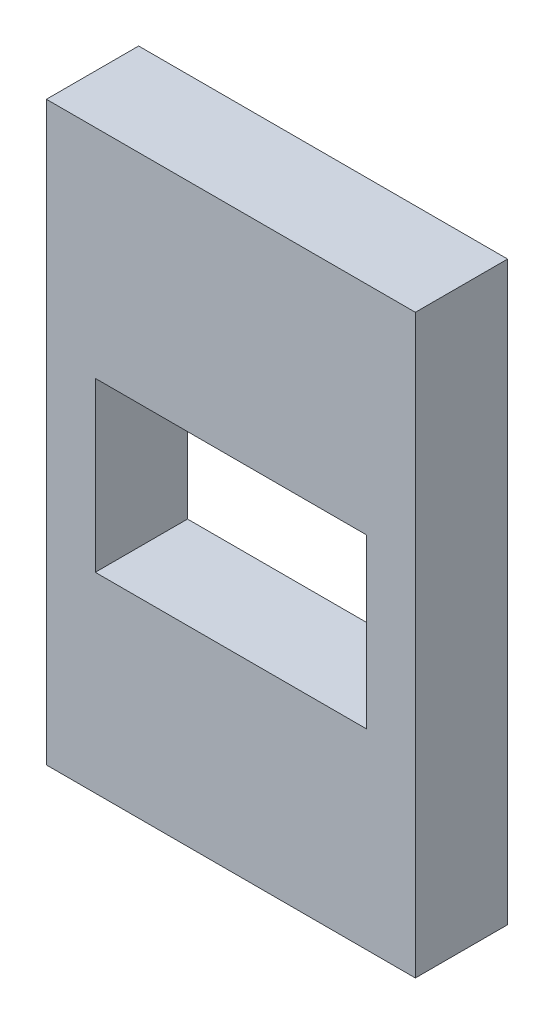
ISO-10303-21;
HEADER;
FILE_DESCRIPTION(('STEP AP214'),'2;1');
FILE_NAME('part.step','',(''),(''),'','','');
FILE_SCHEMA(('AUTOMOTIVE_DESIGN { 1 0 10303 214 1 1 1 1 }'));
ENDSEC;
DATA;
#1=APPLICATION_CONTEXT('core data for automotive mechanical design processes');
#2=APPLICATION_PROTOCOL_DEFINITION('international standard','automotive_design',2000,#1);
#3=PRODUCT_CONTEXT('',#1,'mechanical');
#4=PRODUCT('Part','Part','',(#3));
#5=PRODUCT_RELATED_PRODUCT_CATEGORY('part','',(#4));
#6=PRODUCT_DEFINITION_FORMATION('','',#4);
#7=PRODUCT_DEFINITION_CONTEXT('part definition',#1,'design');
#8=PRODUCT_DEFINITION('design','',#6,#7);
#9=PRODUCT_DEFINITION_SHAPE('','',#8);
#10=(LENGTH_UNIT() NAMED_UNIT(*) SI_UNIT(.MILLI.,.METRE.));
#11=(NAMED_UNIT(*) PLANE_ANGLE_UNIT() SI_UNIT($,.RADIAN.));
#12=(NAMED_UNIT(*) SI_UNIT($,.STERADIAN.) SOLID_ANGLE_UNIT());
#13=UNCERTAINTY_MEASURE_WITH_UNIT(LENGTH_MEASURE(1.E-05),#10,'distance_accuracy_value','');
#14=(GEOMETRIC_REPRESENTATION_CONTEXT(3) GLOBAL_UNCERTAINTY_ASSIGNED_CONTEXT((#13)) GLOBAL_UNIT_ASSIGNED_CONTEXT((#10,
#11,#12)) REPRESENTATION_CONTEXT('',''));
#15=CARTESIAN_POINT('',(0.,0.,0.));
#16=DIRECTION('',(0.,0.,1.));
#17=DIRECTION('',(1.,0.,0.));
#18=AXIS2_PLACEMENT_3D('',#15,#16,#17);
#19=CARTESIAN_POINT('',(-16.,-25.,8.));
#20=DIRECTION('',(1.,0.,0.));
#21=DIRECTION('',(0.,0.,-1.));
#22=AXIS2_PLACEMENT_3D('',#19,#20,#21);
#23=PLANE('',#22);
#24=DIRECTION('',(0.,-1.,0.));
#25=VECTOR('',#24,1.);
#26=CARTESIAN_POINT('',(-16.,-25.,0.));
#27=LINE('',#26,#25);
#28=CARTESIAN_POINT('',(-16.,25.,0.));
#29=VERTEX_POINT('',#28);
#30=CARTESIAN_POINT('',(-16.,-25.,0.));
#31=VERTEX_POINT('',#30);
#32=EDGE_CURVE('E153',#29,#31,#27,.T.);
#33=ORIENTED_EDGE('',*,*,#32,.T.);
#34=DIRECTION('',(0.,0.,-1.));
#35=VECTOR('',#34,1.);
#36=CARTESIAN_POINT('',(-16.,-25.,8.));
#37=LINE('',#36,#35);
#38=CARTESIAN_POINT('',(-16.,-25.,8.));
#39=VERTEX_POINT('',#38);
#40=EDGE_CURVE('E11',#39,#31,#37,.T.);
#41=ORIENTED_EDGE('',*,*,#40,.F.);
#42=DIRECTION('',(0.,-1.,0.));
#43=VECTOR('',#42,1.);
#44=CARTESIAN_POINT('',(-16.,-25.,8.));
#45=LINE('',#44,#43);
#46=CARTESIAN_POINT('',(-16.,25.,8.));
#47=VERTEX_POINT('',#46);
#48=EDGE_CURVE('E159',#47,#39,#45,.T.);
#49=ORIENTED_EDGE('',*,*,#48,.F.);
#50=DIRECTION('',(0.,0.,-1.));
#51=VECTOR('',#50,1.);
#52=CARTESIAN_POINT('',(-16.,25.,8.));
#53=LINE('',#52,#51);
#54=EDGE_CURVE('E173',#47,#29,#53,.T.);
#55=ORIENTED_EDGE('',*,*,#54,.T.);
#56=EDGE_LOOP('',(#33,#41,#49,#55));
#57=FACE_BOUND('',#56,.T.);
#58=ADVANCED_FACE('F45',(#57),#23,.F.);
#59=CARTESIAN_POINT('',(16.,-25.,8.));
#60=DIRECTION('',(0.,1.,0.));
#61=DIRECTION('',(0.,0.,1.));
#62=AXIS2_PLACEMENT_3D('',#59,#60,#61);
#63=PLANE('',#62);
#64=DIRECTION('',(1.,0.,0.));
#65=VECTOR('',#64,1.);
#66=CARTESIAN_POINT('',(16.,-25.,0.));
#67=LINE('',#66,#65);
#68=CARTESIAN_POINT('',(16.,-25.,0.));
#69=VERTEX_POINT('',#68);
#70=EDGE_CURVE('E177',#31,#69,#67,.T.);
#71=ORIENTED_EDGE('',*,*,#70,.T.);
#72=DIRECTION('',(0.,0.,-1.));
#73=VECTOR('',#72,1.);
#74=CARTESIAN_POINT('',(16.,-25.,8.));
#75=LINE('',#74,#73);
#76=CARTESIAN_POINT('',(16.,-25.,8.));
#77=VERTEX_POINT('',#76);
#78=EDGE_CURVE('E53',#77,#69,#75,.T.);
#79=ORIENTED_EDGE('',*,*,#78,.F.);
#80=DIRECTION('',(1.,0.,0.));
#81=VECTOR('',#80,1.);
#82=CARTESIAN_POINT('',(16.,-25.,8.));
#83=LINE('',#82,#81);
#84=EDGE_CURVE('E163',#39,#77,#83,.T.);
#85=ORIENTED_EDGE('',*,*,#84,.F.);
#86=ORIENTED_EDGE('',*,*,#40,.T.);
#87=EDGE_LOOP('',(#71,#79,#85,#86));
#88=FACE_BOUND('',#87,.T.);
#89=ADVANCED_FACE('F211',(#88),#63,.F.);
#90=CARTESIAN_POINT('',(16.,-25.,8.));
#91=DIRECTION('',(-1.,0.,0.));
#92=DIRECTION('',(0.,0.,1.));
#93=AXIS2_PLACEMENT_3D('',#90,#91,#92);
#94=PLANE('',#93);
#95=DIRECTION('',(0.,1.,0.));
#96=VECTOR('',#95,1.);
#97=CARTESIAN_POINT('',(16.,-25.,0.));
#98=LINE('',#97,#96);
#99=CARTESIAN_POINT('',(16.,25.,0.));
#100=VERTEX_POINT('',#99);
#101=EDGE_CURVE('E180',#69,#100,#98,.T.);
#102=ORIENTED_EDGE('',*,*,#101,.T.);
#103=DIRECTION('',(0.,0.,-1.));
#104=VECTOR('',#103,1.);
#105=CARTESIAN_POINT('',(16.,25.,8.));
#106=LINE('',#105,#104);
#107=CARTESIAN_POINT('',(16.,25.,8.));
#108=VERTEX_POINT('',#107);
#109=EDGE_CURVE('E188',#108,#100,#106,.T.);
#110=ORIENTED_EDGE('',*,*,#109,.F.);
#111=DIRECTION('',(0.,1.,0.));
#112=VECTOR('',#111,1.);
#113=CARTESIAN_POINT('',(16.,-25.,8.));
#114=LINE('',#113,#112);
#115=EDGE_CURVE('E167',#77,#108,#114,.T.);
#116=ORIENTED_EDGE('',*,*,#115,.F.);
#117=ORIENTED_EDGE('',*,*,#78,.T.);
#118=EDGE_LOOP('',(#102,#110,#116,#117));
#119=FACE_BOUND('',#118,.T.);
#120=ADVANCED_FACE('F197',(#119),#94,.F.);
#121=CARTESIAN_POINT('',(16.,25.,8.));
#122=DIRECTION('',(0.,-1.,0.));
#123=DIRECTION('',(0.,0.,-1.));
#124=AXIS2_PLACEMENT_3D('',#121,#122,#123);
#125=PLANE('',#124);
#126=DIRECTION('',(-1.,0.,0.));
#127=VECTOR('',#126,1.);
#128=CARTESIAN_POINT('',(16.,25.,0.));
#129=LINE('',#128,#127);
#130=EDGE_CURVE('E164',#100,#29,#129,.T.);
#131=ORIENTED_EDGE('',*,*,#130,.T.);
#132=ORIENTED_EDGE('',*,*,#54,.F.);
#133=DIRECTION('',(-1.,0.,0.));
#134=VECTOR('',#133,1.);
#135=CARTESIAN_POINT('',(16.,25.,8.));
#136=LINE('',#135,#134);
#137=EDGE_CURVE('E170',#108,#47,#136,.T.);
#138=ORIENTED_EDGE('',*,*,#137,.F.);
#139=ORIENTED_EDGE('',*,*,#109,.T.);
#140=EDGE_LOOP('',(#131,#132,#138,#139));
#141=FACE_BOUND('',#140,.T.);
#142=ADVANCED_FACE('F206',(#141),#125,.F.);
#143=CARTESIAN_POINT('',(0.,0.,8.));
#144=DIRECTION('',(0.,0.,1.));
#145=DIRECTION('',(1.,0.,0.));
#146=AXIS2_PLACEMENT_3D('',#143,#144,#145);
#147=PLANE('',#146);
#148=DIRECTION('',(0.,-1.,0.));
#149=VECTOR('',#148,1.);
#150=CARTESIAN_POINT('',(11.76,-8.40999999999999,8.));
#151=LINE('',#150,#149);
#152=CARTESIAN_POINT('',(11.76,6.16,8.));
#153=VERTEX_POINT('',#152);
#154=CARTESIAN_POINT('',(11.76,-8.40999999999999,8.));
#155=VERTEX_POINT('',#154);
#156=EDGE_CURVE('E112',#153,#155,#151,.T.);
#157=ORIENTED_EDGE('',*,*,#156,.T.);
#158=DIRECTION('',(-1.,0.,0.));
#159=VECTOR('',#158,1.);
#160=CARTESIAN_POINT('',(-11.76,-8.40999999999999,8.));
#161=LINE('',#160,#159);
#162=CARTESIAN_POINT('',(-11.76,-8.40999999999999,8.));
#163=VERTEX_POINT('',#162);
#164=EDGE_CURVE('E122',#155,#163,#161,.T.);
#165=ORIENTED_EDGE('',*,*,#164,.T.);
#166=DIRECTION('',(0.,1.,0.));
#167=VECTOR('',#166,1.);
#168=CARTESIAN_POINT('',(-11.76,-8.40999999999999,8.));
#169=LINE('',#168,#167);
#170=CARTESIAN_POINT('',(-11.76,6.16,8.));
#171=VERTEX_POINT('',#170);
#172=EDGE_CURVE('E60',#163,#171,#169,.T.);
#173=ORIENTED_EDGE('',*,*,#172,.T.);
#174=DIRECTION('',(1.,0.,0.));
#175=VECTOR('',#174,1.);
#176=CARTESIAN_POINT('',(-11.76,6.16,8.));
#177=LINE('',#176,#175);
#178=EDGE_CURVE('E119',#171,#153,#177,.T.);
#179=ORIENTED_EDGE('',*,*,#178,.T.);
#180=EDGE_LOOP('',(#157,#165,#173,#179));
#181=FACE_BOUND('',#180,.T.);
#182=ORIENTED_EDGE('',*,*,#48,.T.);
#183=ORIENTED_EDGE('',*,*,#84,.T.);
#184=ORIENTED_EDGE('',*,*,#115,.T.);
#185=ORIENTED_EDGE('',*,*,#137,.T.);
#186=EDGE_LOOP('',(#182,#183,#184,#185));
#187=FACE_BOUND('',#186,.T.);
#188=ADVANCED_FACE('F127',(#181,#187),#147,.T.);
#189=CARTESIAN_POINT('',(0.,0.,0.));
#190=DIRECTION('',(0.,0.,1.));
#191=DIRECTION('',(1.,0.,0.));
#192=AXIS2_PLACEMENT_3D('',#189,#190,#191);
#193=PLANE('',#192);
#194=DIRECTION('',(-1.,0.,0.));
#195=VECTOR('',#194,1.);
#196=CARTESIAN_POINT('',(-11.76,-8.40999999999999,0.));
#197=LINE('',#196,#195);
#198=CARTESIAN_POINT('',(11.76,-8.40999999999999,0.));
#199=VERTEX_POINT('',#198);
#200=CARTESIAN_POINT('',(-11.76,-8.40999999999999,0.));
#201=VERTEX_POINT('',#200);
#202=EDGE_CURVE('E144',#199,#201,#197,.T.);
#203=ORIENTED_EDGE('',*,*,#202,.F.);
#204=DIRECTION('',(0.,-1.,0.));
#205=VECTOR('',#204,1.);
#206=CARTESIAN_POINT('',(11.76,-8.40999999999999,0.));
#207=LINE('',#206,#205);
#208=CARTESIAN_POINT('',(11.76,6.16,0.));
#209=VERTEX_POINT('',#208);
#210=EDGE_CURVE('E68',#209,#199,#207,.T.);
#211=ORIENTED_EDGE('',*,*,#210,.F.);
#212=DIRECTION('',(1.,0.,0.));
#213=VECTOR('',#212,1.);
#214=CARTESIAN_POINT('',(-11.76,6.16,0.));
#215=LINE('',#214,#213);
#216=CARTESIAN_POINT('',(-11.76,6.16,0.));
#217=VERTEX_POINT('',#216);
#218=EDGE_CURVE('E131',#217,#209,#215,.T.);
#219=ORIENTED_EDGE('',*,*,#218,.F.);
#220=DIRECTION('',(0.,1.,0.));
#221=VECTOR('',#220,1.);
#222=CARTESIAN_POINT('',(-11.76,-8.40999999999999,0.));
#223=LINE('',#222,#221);
#224=EDGE_CURVE('E135',#201,#217,#223,.T.);
#225=ORIENTED_EDGE('',*,*,#224,.F.);
#226=EDGE_LOOP('',(#203,#211,#219,#225));
#227=FACE_BOUND('',#226,.T.);
#228=ORIENTED_EDGE('',*,*,#32,.F.);
#229=ORIENTED_EDGE('',*,*,#130,.F.);
#230=ORIENTED_EDGE('',*,*,#101,.F.);
#231=ORIENTED_EDGE('',*,*,#70,.F.);
#232=EDGE_LOOP('',(#228,#229,#230,#231));
#233=FACE_BOUND('',#232,.T.);
#234=ADVANCED_FACE('F203',(#227,#233),#193,.F.);
#235=CARTESIAN_POINT('',(11.76,-8.40999999999999,8.));
#236=DIRECTION('',(1.,0.,0.));
#237=DIRECTION('',(0.,0.,-1.));
#238=AXIS2_PLACEMENT_3D('',#235,#236,#237);
#239=PLANE('',#238);
#240=ORIENTED_EDGE('',*,*,#210,.T.);
#241=DIRECTION('',(0.,0.,-1.));
#242=VECTOR('',#241,1.);
#243=CARTESIAN_POINT('',(11.76,-8.40999999999999,8.));
#244=LINE('',#243,#242);
#245=EDGE_CURVE('E108',#155,#199,#244,.T.);
#246=ORIENTED_EDGE('',*,*,#245,.F.);
#247=ORIENTED_EDGE('',*,*,#156,.F.);
#248=DIRECTION('',(0.,0.,-1.));
#249=VECTOR('',#248,1.);
#250=CARTESIAN_POINT('',(11.76,6.16,8.));
#251=LINE('',#250,#249);
#252=EDGE_CURVE('E150',#153,#209,#251,.T.);
#253=ORIENTED_EDGE('',*,*,#252,.T.);
#254=EDGE_LOOP('',(#240,#246,#247,#253));
#255=FACE_BOUND('',#254,.T.);
#256=ADVANCED_FACE('F110',(#255),#239,.F.);
#257=CARTESIAN_POINT('',(-11.76,6.16,8.));
#258=DIRECTION('',(0.,1.,0.));
#259=DIRECTION('',(0.,0.,1.));
#260=AXIS2_PLACEMENT_3D('',#257,#258,#259);
#261=PLANE('',#260);
#262=ORIENTED_EDGE('',*,*,#218,.T.);
#263=ORIENTED_EDGE('',*,*,#252,.F.);
#264=ORIENTED_EDGE('',*,*,#178,.F.);
#265=DIRECTION('',(0.,0.,-1.));
#266=VECTOR('',#265,1.);
#267=CARTESIAN_POINT('',(-11.76,6.16,8.));
#268=LINE('',#267,#266);
#269=EDGE_CURVE('E154',#171,#217,#268,.T.);
#270=ORIENTED_EDGE('',*,*,#269,.T.);
#271=EDGE_LOOP('',(#262,#263,#264,#270));
#272=FACE_BOUND('',#271,.T.);
#273=ADVANCED_FACE('F228',(#272),#261,.F.);
#274=CARTESIAN_POINT('',(-11.76,-8.40999999999999,8.));
#275=DIRECTION('',(-1.,0.,0.));
#276=DIRECTION('',(0.,0.,1.));
#277=AXIS2_PLACEMENT_3D('',#274,#275,#276);
#278=PLANE('',#277);
#279=ORIENTED_EDGE('',*,*,#224,.T.);
#280=ORIENTED_EDGE('',*,*,#269,.F.);
#281=ORIENTED_EDGE('',*,*,#172,.F.);
#282=DIRECTION('',(0.,0.,-1.));
#283=VECTOR('',#282,1.);
#284=CARTESIAN_POINT('',(-11.76,-8.40999999999999,8.));
#285=LINE('',#284,#283);
#286=EDGE_CURVE('E118',#163,#201,#285,.T.);
#287=ORIENTED_EDGE('',*,*,#286,.T.);
#288=EDGE_LOOP('',(#279,#280,#281,#287));
#289=FACE_BOUND('',#288,.T.);
#290=ADVANCED_FACE('F231',(#289),#278,.F.);
#291=CARTESIAN_POINT('',(-11.76,-8.40999999999999,8.));
#292=DIRECTION('',(0.,-1.,0.));
#293=DIRECTION('',(0.,0.,-1.));
#294=AXIS2_PLACEMENT_3D('',#291,#292,#293);
#295=PLANE('',#294);
#296=ORIENTED_EDGE('',*,*,#202,.T.);
#297=ORIENTED_EDGE('',*,*,#286,.F.);
#298=ORIENTED_EDGE('',*,*,#164,.F.);
#299=ORIENTED_EDGE('',*,*,#245,.T.);
#300=EDGE_LOOP('',(#296,#297,#298,#299));
#301=FACE_BOUND('',#300,.T.);
#302=ADVANCED_FACE('F123',(#301),#295,.F.);
#303=CLOSED_SHELL('',(#58,#89,#120,#142,#188,#234,#256,#273,#290,#302));
#304=MANIFOLD_SOLID_BREP('B2',#303);
#305=ADVANCED_BREP_SHAPE_REPRESENTATION('',(#18,#304),#14);
#306=SHAPE_DEFINITION_REPRESENTATION(#9,#305);
ENDSEC;
END-ISO-10303-21;
